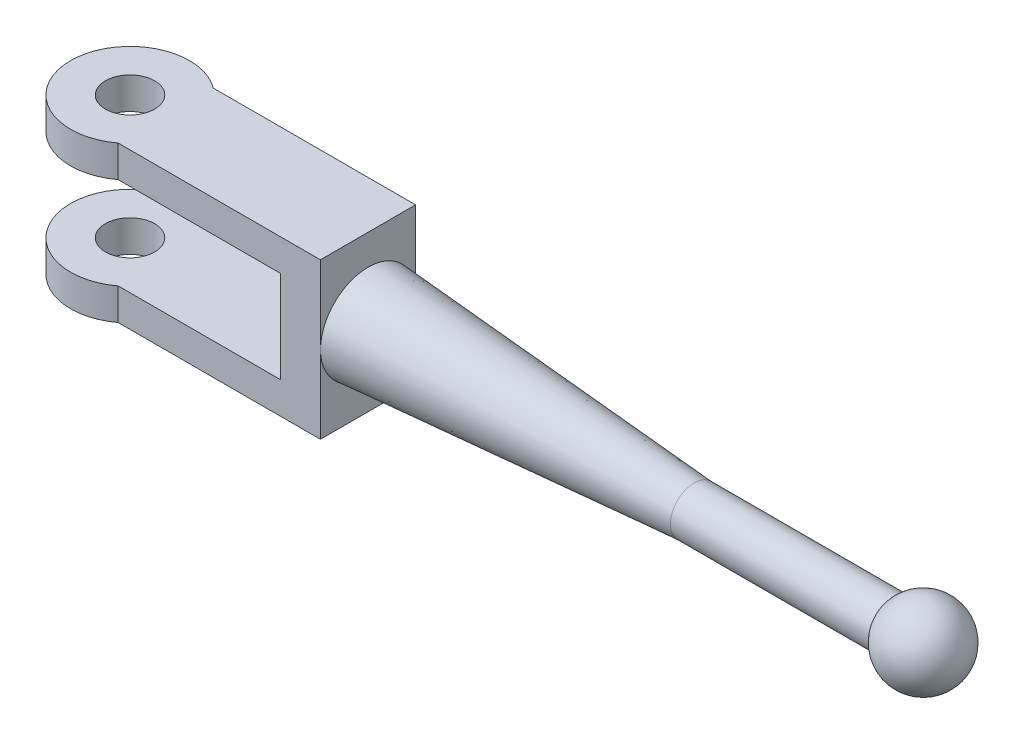
ISO-10303-21;
HEADER;
FILE_DESCRIPTION(('STEP AP214'),'2;1');
FILE_NAME('part.step','',(''),(''),'','','');
FILE_SCHEMA(('AUTOMOTIVE_DESIGN { 1 0 10303 214 1 1 1 1 }'));
ENDSEC;
DATA;
#1=APPLICATION_CONTEXT('core data for automotive mechanical design processes');
#2=APPLICATION_PROTOCOL_DEFINITION('international standard','automotive_design',2000,#1);
#3=PRODUCT_CONTEXT('',#1,'mechanical');
#4=PRODUCT('Part','Part','',(#3));
#5=PRODUCT_RELATED_PRODUCT_CATEGORY('part','',(#4));
#6=PRODUCT_DEFINITION_FORMATION('','',#4);
#7=PRODUCT_DEFINITION_CONTEXT('part definition',#1,'design');
#8=PRODUCT_DEFINITION('design','',#6,#7);
#9=PRODUCT_DEFINITION_SHAPE('','',#8);
#10=(LENGTH_UNIT() NAMED_UNIT(*) SI_UNIT(.MILLI.,.METRE.));
#11=(NAMED_UNIT(*) PLANE_ANGLE_UNIT() SI_UNIT($,.RADIAN.));
#12=(NAMED_UNIT(*) SI_UNIT($,.STERADIAN.) SOLID_ANGLE_UNIT());
#13=UNCERTAINTY_MEASURE_WITH_UNIT(LENGTH_MEASURE(1.E-05),#10,'distance_accuracy_value','');
#14=(GEOMETRIC_REPRESENTATION_CONTEXT(3) GLOBAL_UNCERTAINTY_ASSIGNED_CONTEXT((#13)) GLOBAL_UNIT_ASSIGNED_CONTEXT((#10,
#11,#12)) REPRESENTATION_CONTEXT('',''));
#15=CARTESIAN_POINT('',(0.,0.,0.));
#16=DIRECTION('',(0.,0.,1.));
#17=DIRECTION('',(1.,0.,0.));
#18=AXIS2_PLACEMENT_3D('',#15,#16,#17);
#19=CARTESIAN_POINT('',(30.012460240286,9.8,0.));
#20=DIRECTION('',(1.,0.,0.));
#21=DIRECTION('',(0.,0.,-1.));
#22=AXIS2_PLACEMENT_3D('',#19,#20,#21);
#23=CONICAL_SURFACE('',#22,6.,1.56871962306596);
#24=CARTESIAN_POINT('',(30.,9.8,0.));
#25=VERTEX_POINT('',#24);
#26=VERTEX_LOOP('',#25);
#27=FACE_BOUND('',#26,.T.);
#28=CARTESIAN_POINT('',(30.012460240286,9.8,0.));
#29=DIRECTION('',(-1.,0.,0.));
#30=DIRECTION('',(0.,0.,1.));
#31=AXIS2_PLACEMENT_3D('',#28,#29,#30);
#32=CIRCLE('',#31,6.);
#33=CARTESIAN_POINT('',(30.012460240286,9.8,6.));
#34=VERTEX_POINT('',#33);
#35=EDGE_CURVE('E63',#34,#34,#32,.T.);
#36=ORIENTED_EDGE('',*,*,#35,.T.);
#37=EDGE_LOOP('',(#36));
#38=FACE_BOUND('',#37,.T.);
#39=ADVANCED_FACE('F49',(#27,#38),#23,.T.);
#40=CARTESIAN_POINT('',(100.,9.8,0.));
#41=DIRECTION('',(-1.,0.,0.));
#42=DIRECTION('',(0.,1.,0.));
#43=AXIS2_PLACEMENT_3D('',#40,#41,#42);
#44=SPHERICAL_SURFACE('',#43,4.9);
#45=CARTESIAN_POINT('',(96.1257258744379,9.8,0.));
#46=DIRECTION('',(-1.,0.,0.));
#47=DIRECTION('',(0.,0.,1.));
#48=AXIS2_PLACEMENT_3D('',#45,#46,#47);
#49=CIRCLE('',#48,3.);
#50=CARTESIAN_POINT('',(96.1257258744379,9.8,3.));
#51=VERTEX_POINT('',#50);
#52=EDGE_CURVE('E12',#51,#51,#49,.T.);
#53=ORIENTED_EDGE('',*,*,#52,.F.);
#54=EDGE_LOOP('',(#53));
#55=FACE_BOUND('',#54,.T.);
#56=ADVANCED_FACE('F60',(#55),#44,.T.);
#57=CARTESIAN_POINT('',(30.,9.8,0.));
#58=DIRECTION('',(-1.,0.,0.));
#59=DIRECTION('',(0.,0.,1.));
#60=AXIS2_PLACEMENT_3D('',#57,#58,#59);
#61=CYLINDRICAL_SURFACE('',#60,3.);
#62=CARTESIAN_POINT('',(71.1257258744379,9.8,0.));
#63=DIRECTION('',(-1.,0.,0.));
#64=DIRECTION('',(0.,0.,1.));
#65=AXIS2_PLACEMENT_3D('',#62,#63,#64);
#66=CIRCLE('',#65,2.99999999999999);
#67=CARTESIAN_POINT('',(71.1257258744379,9.8,2.99999999999999));
#68=VERTEX_POINT('',#67);
#69=EDGE_CURVE('E55',#68,#68,#66,.T.);
#70=ORIENTED_EDGE('',*,*,#69,.F.);
#71=EDGE_LOOP('',(#70));
#72=FACE_BOUND('',#71,.T.);
#73=ORIENTED_EDGE('',*,*,#52,.T.);
#74=EDGE_LOOP('',(#73));
#75=FACE_BOUND('',#74,.T.);
#76=ADVANCED_FACE('F71',(#72,#75),#61,.T.);
#77=CARTESIAN_POINT('',(71.1257258744379,9.8,0.));
#78=DIRECTION('',(-1.,0.,0.));
#79=DIRECTION('',(0.,0.,1.));
#80=AXIS2_PLACEMENT_3D('',#77,#78,#79);
#81=CONICAL_SURFACE('',#80,2.99999999999999,0.0728400530304784);
#82=ORIENTED_EDGE('',*,*,#35,.F.);
#83=EDGE_LOOP('',(#82));
#84=FACE_BOUND('',#83,.T.);
#85=ORIENTED_EDGE('',*,*,#69,.T.);
#86=EDGE_LOOP('',(#85));
#87=FACE_BOUND('',#86,.T.);
#88=ADVANCED_FACE('F69',(#84,#87),#81,.T.);
#89=CLOSED_SHELL('',(#39,#56,#76,#88));
#90=MANIFOLD_SOLID_BREP('B2',#89);
#91=CARTESIAN_POINT('',(25.,0.,0.));
#92=DIRECTION('',(1.,0.,0.));
#93=DIRECTION('',(0.,0.,-1.));
#94=AXIS2_PLACEMENT_3D('',#91,#92,#93);
#95=PLANE('',#94);
#96=DIRECTION('',(0.,0.,1.));
#97=VECTOR('',#96,1.);
#98=CARTESIAN_POINT('',(25.,15.6,0.));
#99=LINE('',#98,#97);
#100=CARTESIAN_POINT('',(25.,15.6,-6.));
#101=VERTEX_POINT('',#100);
#102=CARTESIAN_POINT('',(25.,15.6,6.));
#103=VERTEX_POINT('',#102);
#104=EDGE_CURVE('E115',#101,#103,#99,.T.);
#105=ORIENTED_EDGE('',*,*,#104,.F.);
#106=DIRECTION('',(0.,1.,0.));
#107=VECTOR('',#106,1.);
#108=CARTESIAN_POINT('',(25.,19.6,-6.));
#109=LINE('',#108,#107);
#110=CARTESIAN_POINT('',(25.,4.,-6.));
#111=VERTEX_POINT('',#110);
#112=EDGE_CURVE('E198',#111,#101,#109,.T.);
#113=ORIENTED_EDGE('',*,*,#112,.F.);
#114=DIRECTION('',(0.,0.,-1.));
#115=VECTOR('',#114,1.);
#116=CARTESIAN_POINT('',(25.,4.,0.));
#117=LINE('',#116,#115);
#118=CARTESIAN_POINT('',(25.,4.,6.));
#119=VERTEX_POINT('',#118);
#120=EDGE_CURVE('E194',#119,#111,#117,.T.);
#121=ORIENTED_EDGE('',*,*,#120,.F.);
#122=DIRECTION('',(0.,-1.,0.));
#123=VECTOR('',#122,1.);
#124=CARTESIAN_POINT('',(25.,19.6,6.));
#125=LINE('',#124,#123);
#126=EDGE_CURVE('E237',#103,#119,#125,.T.);
#127=ORIENTED_EDGE('',*,*,#126,.F.);
#128=EDGE_LOOP('',(#105,#113,#121,#127));
#129=FACE_BOUND('',#128,.T.);
#130=ADVANCED_FACE('F107',(#129),#95,.F.);
#131=CARTESIAN_POINT('',(0.,4.,0.));
#132=DIRECTION('',(0.,1.,0.));
#133=DIRECTION('',(0.,0.,1.));
#134=AXIS2_PLACEMENT_3D('',#131,#132,#133);
#135=PLANE('',#134);
#136=DIRECTION('',(-1.,0.,0.));
#137=VECTOR('',#136,1.);
#138=CARTESIAN_POINT('',(0.,4.,-6.));
#139=LINE('',#138,#137);
#140=CARTESIAN_POINT('',(4.5,4.,-6.));
#141=VERTEX_POINT('',#140);
#142=EDGE_CURVE('E212',#111,#141,#139,.T.);
#143=ORIENTED_EDGE('',*,*,#142,.T.);
#144=CARTESIAN_POINT('',(0.,4.,0.));
#145=DIRECTION('',(0.,-1.,0.));
#146=DIRECTION('',(0.,0.,-1.));
#147=AXIS2_PLACEMENT_3D('',#144,#145,#146);
#148=CIRCLE('',#147,7.5);
#149=CARTESIAN_POINT('',(4.5,4.,6.));
#150=VERTEX_POINT('',#149);
#151=EDGE_CURVE('E250',#150,#141,#148,.T.);
#152=ORIENTED_EDGE('',*,*,#151,.F.);
#153=DIRECTION('',(1.,0.,0.));
#154=VECTOR('',#153,1.);
#155=CARTESIAN_POINT('',(30.,4.,6.));
#156=LINE('',#155,#154);
#157=EDGE_CURVE('E210',#150,#119,#156,.T.);
#158=ORIENTED_EDGE('',*,*,#157,.T.);
#159=ORIENTED_EDGE('',*,*,#120,.T.);
#160=EDGE_LOOP('',(#143,#152,#158,#159));
#161=FACE_BOUND('',#160,.T.);
#162=CARTESIAN_POINT('',(0.,4.,0.));
#163=DIRECTION('',(0.,1.,0.));
#164=DIRECTION('',(0.,0.,1.));
#165=AXIS2_PLACEMENT_3D('',#162,#163,#164);
#166=CIRCLE('',#165,3.1);
#167=CARTESIAN_POINT('',(0.,4.,3.1));
#168=VERTEX_POINT('',#167);
#169=EDGE_CURVE('E204',#168,#168,#166,.T.);
#170=ORIENTED_EDGE('',*,*,#169,.F.);
#171=EDGE_LOOP('',(#170));
#172=FACE_BOUND('',#171,.T.);
#173=ADVANCED_FACE('F261',(#161,#172),#135,.T.);
#174=CARTESIAN_POINT('',(0.,0.,0.));
#175=DIRECTION('',(0.,1.,0.));
#176=DIRECTION('',(0.,0.,1.));
#177=AXIS2_PLACEMENT_3D('',#174,#175,#176);
#178=PLANE('',#177);
#179=DIRECTION('',(1.,0.,0.));
#180=VECTOR('',#179,1.);
#181=CARTESIAN_POINT('',(30.,0.,6.));
#182=LINE('',#181,#180);
#183=CARTESIAN_POINT('',(4.5,0.,6.));
#184=VERTEX_POINT('',#183);
#185=CARTESIAN_POINT('',(30.,0.,6.));
#186=VERTEX_POINT('',#185);
#187=EDGE_CURVE('E207',#184,#186,#182,.T.);
#188=ORIENTED_EDGE('',*,*,#187,.F.);
#189=CARTESIAN_POINT('',(0.,0.,0.));
#190=DIRECTION('',(0.,-1.,0.));
#191=DIRECTION('',(0.,0.,-1.));
#192=AXIS2_PLACEMENT_3D('',#189,#190,#191);
#193=CIRCLE('',#192,7.5);
#194=CARTESIAN_POINT('',(4.5,0.,-6.));
#195=VERTEX_POINT('',#194);
#196=EDGE_CURVE('E251',#184,#195,#193,.T.);
#197=ORIENTED_EDGE('',*,*,#196,.T.);
#198=DIRECTION('',(-1.,0.,0.));
#199=VECTOR('',#198,1.);
#200=CARTESIAN_POINT('',(0.,0.,-6.));
#201=LINE('',#200,#199);
#202=CARTESIAN_POINT('',(30.,0.,-6.));
#203=VERTEX_POINT('',#202);
#204=EDGE_CURVE('E213',#203,#195,#201,.T.);
#205=ORIENTED_EDGE('',*,*,#204,.F.);
#206=DIRECTION('',(0.,0.,-1.));
#207=VECTOR('',#206,1.);
#208=CARTESIAN_POINT('',(30.,0.,-6.));
#209=LINE('',#208,#207);
#210=EDGE_CURVE('E218',#186,#203,#209,.T.);
#211=ORIENTED_EDGE('',*,*,#210,.F.);
#212=EDGE_LOOP('',(#188,#197,#205,#211));
#213=FACE_BOUND('',#212,.T.);
#214=CARTESIAN_POINT('',(0.,0.,0.));
#215=DIRECTION('',(0.,1.,0.));
#216=DIRECTION('',(0.,0.,1.));
#217=AXIS2_PLACEMENT_3D('',#214,#215,#216);
#218=CIRCLE('',#217,3.1);
#219=CARTESIAN_POINT('',(0.,0.,3.1));
#220=VERTEX_POINT('',#219);
#221=EDGE_CURVE('E196',#220,#220,#218,.T.);
#222=ORIENTED_EDGE('',*,*,#221,.T.);
#223=EDGE_LOOP('',(#222));
#224=FACE_BOUND('',#223,.T.);
#225=ADVANCED_FACE('F270',(#213,#224),#178,.F.);
#226=CARTESIAN_POINT('',(30.,4.,6.));
#227=DIRECTION('',(0.,0.,-1.));
#228=DIRECTION('',(-1.,0.,0.));
#229=AXIS2_PLACEMENT_3D('',#226,#227,#228);
#230=PLANE('',#229);
#231=ORIENTED_EDGE('',*,*,#157,.F.);
#232=DIRECTION('',(0.,-1.,0.));
#233=VECTOR('',#232,1.);
#234=CARTESIAN_POINT('',(4.5,4.,6.));
#235=LINE('',#234,#233);
#236=EDGE_CURVE('E125',#150,#184,#235,.T.);
#237=ORIENTED_EDGE('',*,*,#236,.T.);
#238=ORIENTED_EDGE('',*,*,#187,.T.);
#239=DIRECTION('',(0.,-1.,0.));
#240=VECTOR('',#239,1.);
#241=CARTESIAN_POINT('',(30.,4.,6.));
#242=LINE('',#241,#240);
#243=CARTESIAN_POINT('',(30.,19.6,6.));
#244=VERTEX_POINT('',#243);
#245=EDGE_CURVE('E192',#244,#186,#242,.T.);
#246=ORIENTED_EDGE('',*,*,#245,.F.);
#247=DIRECTION('',(1.,0.,0.));
#248=VECTOR('',#247,1.);
#249=CARTESIAN_POINT('',(25.,19.6,6.));
#250=LINE('',#249,#248);
#251=CARTESIAN_POINT('',(4.5,19.6,6.));
#252=VERTEX_POINT('',#251);
#253=EDGE_CURVE('E187',#252,#244,#250,.T.);
#254=ORIENTED_EDGE('',*,*,#253,.F.);
#255=DIRECTION('',(0.,1.,0.));
#256=VECTOR('',#255,1.);
#257=CARTESIAN_POINT('',(4.5,15.6,6.));
#258=LINE('',#257,#256);
#259=CARTESIAN_POINT('',(4.5,15.6,6.));
#260=VERTEX_POINT('',#259);
#261=EDGE_CURVE('E170',#252,#260,#258,.F.);
#262=ORIENTED_EDGE('',*,*,#261,.T.);
#263=DIRECTION('',(1.,0.,0.));
#264=VECTOR('',#263,1.);
#265=CARTESIAN_POINT('',(0.,15.6,6.));
#266=LINE('',#265,#264);
#267=EDGE_CURVE('E229',#260,#103,#266,.T.);
#268=ORIENTED_EDGE('',*,*,#267,.T.);
#269=ORIENTED_EDGE('',*,*,#126,.T.);
#270=EDGE_LOOP('',(#231,#237,#238,#246,#254,#262,#268,#269));
#271=FACE_BOUND('',#270,.T.);
#272=ADVANCED_FACE('F109',(#271),#230,.F.);
#273=CARTESIAN_POINT('',(30.,4.,-6.));
#274=DIRECTION('',(-1.,0.,0.));
#275=DIRECTION('',(0.,0.,1.));
#276=AXIS2_PLACEMENT_3D('',#273,#274,#275);
#277=PLANE('',#276);
#278=CARTESIAN_POINT('',(30.,9.8,0.));
#279=VERTEX_POINT('',#278);
#280=VERTEX_LOOP('',#279);
#281=FACE_BOUND('',#280,.T.);
#282=ORIENTED_EDGE('',*,*,#245,.T.);
#283=ORIENTED_EDGE('',*,*,#210,.T.);
#284=DIRECTION('',(0.,-1.,0.));
#285=VECTOR('',#284,1.);
#286=CARTESIAN_POINT('',(30.,4.,-6.));
#287=LINE('',#286,#285);
#288=CARTESIAN_POINT('',(30.,19.6,-6.));
#289=VERTEX_POINT('',#288);
#290=EDGE_CURVE('E216',#289,#203,#287,.T.);
#291=ORIENTED_EDGE('',*,*,#290,.F.);
#292=DIRECTION('',(0.,0.,1.));
#293=VECTOR('',#292,1.);
#294=CARTESIAN_POINT('',(30.,19.6,6.));
#295=LINE('',#294,#293);
#296=EDGE_CURVE('E201',#289,#244,#295,.T.);
#297=ORIENTED_EDGE('',*,*,#296,.T.);
#298=EDGE_LOOP('',(#282,#283,#291,#297));
#299=FACE_BOUND('',#298,.T.);
#300=ADVANCED_FACE('F273',(#281,#299),#277,.F.);
#301=CARTESIAN_POINT('',(0.,4.,-6.));
#302=DIRECTION('',(0.,0.,1.));
#303=DIRECTION('',(1.,0.,0.));
#304=AXIS2_PLACEMENT_3D('',#301,#302,#303);
#305=PLANE('',#304);
#306=ORIENTED_EDGE('',*,*,#204,.T.);
#307=DIRECTION('',(0.,-1.,0.));
#308=VECTOR('',#307,1.);
#309=CARTESIAN_POINT('',(4.5,4.,-6.));
#310=LINE('',#309,#308);
#311=EDGE_CURVE('E47',#195,#141,#310,.F.);
#312=ORIENTED_EDGE('',*,*,#311,.T.);
#313=ORIENTED_EDGE('',*,*,#142,.F.);
#314=ORIENTED_EDGE('',*,*,#112,.T.);
#315=DIRECTION('',(-1.,0.,0.));
#316=VECTOR('',#315,1.);
#317=CARTESIAN_POINT('',(30.,15.6,-6.));
#318=LINE('',#317,#316);
#319=CARTESIAN_POINT('',(4.5,15.6,-6.));
#320=VERTEX_POINT('',#319);
#321=EDGE_CURVE('E231',#101,#320,#318,.T.);
#322=ORIENTED_EDGE('',*,*,#321,.T.);
#323=DIRECTION('',(0.,1.,0.));
#324=VECTOR('',#323,1.);
#325=CARTESIAN_POINT('',(4.5,15.6,-6.));
#326=LINE('',#325,#324);
#327=CARTESIAN_POINT('',(4.5,19.6,-6.));
#328=VERTEX_POINT('',#327);
#329=EDGE_CURVE('E180',#320,#328,#326,.T.);
#330=ORIENTED_EDGE('',*,*,#329,.T.);
#331=DIRECTION('',(1.,0.,0.));
#332=VECTOR('',#331,1.);
#333=CARTESIAN_POINT('',(25.,19.6,-6.));
#334=LINE('',#333,#332);
#335=EDGE_CURVE('E189',#328,#289,#334,.T.);
#336=ORIENTED_EDGE('',*,*,#335,.T.);
#337=ORIENTED_EDGE('',*,*,#290,.T.);
#338=EDGE_LOOP('',(#306,#312,#313,#314,#322,#330,#336,#337));
#339=FACE_BOUND('',#338,.T.);
#340=ADVANCED_FACE('F265',(#339),#305,.F.);
#341=CARTESIAN_POINT('',(0.,4.,0.));
#342=DIRECTION('',(0.,-1.,0.));
#343=DIRECTION('',(0.,0.,-1.));
#344=AXIS2_PLACEMENT_3D('',#341,#342,#343);
#345=CYLINDRICAL_SURFACE('',#344,3.1);
#346=ORIENTED_EDGE('',*,*,#169,.T.);
#347=EDGE_LOOP('',(#346));
#348=FACE_BOUND('',#347,.T.);
#349=ORIENTED_EDGE('',*,*,#221,.F.);
#350=EDGE_LOOP('',(#349));
#351=FACE_BOUND('',#350,.T.);
#352=ADVANCED_FACE('F280',(#348,#351),#345,.F.);
#353=CARTESIAN_POINT('',(25.,19.6,6.));
#354=DIRECTION('',(0.,1.,0.));
#355=DIRECTION('',(0.,0.,1.));
#356=AXIS2_PLACEMENT_3D('',#353,#354,#355);
#357=PLANE('',#356);
#358=CARTESIAN_POINT('',(0.,19.6,0.));
#359=DIRECTION('',(0.,1.,0.));
#360=DIRECTION('',(0.,0.,1.));
#361=AXIS2_PLACEMENT_3D('',#358,#359,#360);
#362=CIRCLE('',#361,7.5);
#363=EDGE_CURVE('E173',#328,#252,#362,.T.);
#364=ORIENTED_EDGE('',*,*,#363,.T.);
#365=ORIENTED_EDGE('',*,*,#253,.T.);
#366=ORIENTED_EDGE('',*,*,#296,.F.);
#367=ORIENTED_EDGE('',*,*,#335,.F.);
#368=EDGE_LOOP('',(#364,#365,#366,#367));
#369=FACE_BOUND('',#368,.T.);
#370=CARTESIAN_POINT('',(0.,19.6,0.));
#371=DIRECTION('',(0.,1.,0.));
#372=DIRECTION('',(0.,0.,1.));
#373=AXIS2_PLACEMENT_3D('',#370,#371,#372);
#374=CIRCLE('',#373,3.1);
#375=CARTESIAN_POINT('',(0.,19.6,3.1));
#376=VERTEX_POINT('',#375);
#377=EDGE_CURVE('E242',#376,#376,#374,.T.);
#378=ORIENTED_EDGE('',*,*,#377,.F.);
#379=EDGE_LOOP('',(#378));
#380=FACE_BOUND('',#379,.T.);
#381=ADVANCED_FACE('F184',(#369,#380),#357,.T.);
#382=CARTESIAN_POINT('',(0.,15.6,0.));
#383=DIRECTION('',(0.,1.,0.));
#384=DIRECTION('',(0.,0.,1.));
#385=AXIS2_PLACEMENT_3D('',#382,#383,#384);
#386=PLANE('',#385);
#387=ORIENTED_EDGE('',*,*,#267,.F.);
#388=CARTESIAN_POINT('',(0.,15.6,0.));
#389=DIRECTION('',(0.,1.,0.));
#390=DIRECTION('',(0.,0.,1.));
#391=AXIS2_PLACEMENT_3D('',#388,#389,#390);
#392=CIRCLE('',#391,7.5);
#393=EDGE_CURVE('E176',#320,#260,#392,.T.);
#394=ORIENTED_EDGE('',*,*,#393,.F.);
#395=ORIENTED_EDGE('',*,*,#321,.F.);
#396=ORIENTED_EDGE('',*,*,#104,.T.);
#397=EDGE_LOOP('',(#387,#394,#395,#396));
#398=FACE_BOUND('',#397,.T.);
#399=CARTESIAN_POINT('',(0.,15.6,0.));
#400=DIRECTION('',(0.,1.,0.));
#401=DIRECTION('',(0.,0.,1.));
#402=AXIS2_PLACEMENT_3D('',#399,#400,#401);
#403=CIRCLE('',#402,3.1);
#404=CARTESIAN_POINT('',(0.,15.6,3.1));
#405=VERTEX_POINT('',#404);
#406=EDGE_CURVE('E179',#405,#405,#403,.T.);
#407=ORIENTED_EDGE('',*,*,#406,.T.);
#408=EDGE_LOOP('',(#407));
#409=FACE_BOUND('',#408,.T.);
#410=ADVANCED_FACE('F227',(#398,#409),#386,.F.);
#411=CARTESIAN_POINT('',(0.,19.6,0.));
#412=DIRECTION('',(0.,-1.,0.));
#413=DIRECTION('',(0.,0.,-1.));
#414=AXIS2_PLACEMENT_3D('',#411,#412,#413);
#415=CYLINDRICAL_SURFACE('',#414,3.1);
#416=ORIENTED_EDGE('',*,*,#377,.T.);
#417=EDGE_LOOP('',(#416));
#418=FACE_BOUND('',#417,.T.);
#419=ORIENTED_EDGE('',*,*,#406,.F.);
#420=EDGE_LOOP('',(#419));
#421=FACE_BOUND('',#420,.T.);
#422=ADVANCED_FACE('F314',(#418,#421),#415,.F.);
#423=CARTESIAN_POINT('',(0.,15.6,0.));
#424=DIRECTION('',(0.,1.,0.));
#425=DIRECTION('',(0.,0.,1.));
#426=AXIS2_PLACEMENT_3D('',#423,#424,#425);
#427=CYLINDRICAL_SURFACE('',#426,7.5);
#428=ORIENTED_EDGE('',*,*,#261,.F.);
#429=ORIENTED_EDGE('',*,*,#363,.F.);
#430=ORIENTED_EDGE('',*,*,#329,.F.);
#431=ORIENTED_EDGE('',*,*,#393,.T.);
#432=EDGE_LOOP('',(#428,#429,#430,#431));
#433=FACE_BOUND('',#432,.T.);
#434=ADVANCED_FACE('F172',(#433),#427,.T.);
#435=CARTESIAN_POINT('',(0.,4.,0.));
#436=DIRECTION('',(0.,-1.,0.));
#437=DIRECTION('',(0.,0.,-1.));
#438=AXIS2_PLACEMENT_3D('',#435,#436,#437);
#439=CYLINDRICAL_SURFACE('',#438,7.5);
#440=ORIENTED_EDGE('',*,*,#236,.F.);
#441=ORIENTED_EDGE('',*,*,#151,.T.);
#442=ORIENTED_EDGE('',*,*,#311,.F.);
#443=ORIENTED_EDGE('',*,*,#196,.F.);
#444=EDGE_LOOP('',(#440,#441,#442,#443));
#445=FACE_BOUND('',#444,.T.);
#446=ADVANCED_FACE('F258',(#445),#439,.T.);
#447=CLOSED_SHELL('',(#130,#173,#225,#272,#300,#340,#352,#381,#410,#422,#434,#446));
#448=MANIFOLD_SOLID_BREP('B6',#447);
#449=ADVANCED_BREP_SHAPE_REPRESENTATION('',(#18,#90,#448),#14);
#450=SHAPE_DEFINITION_REPRESENTATION(#9,#449);
ENDSEC;
END-ISO-10303-21;
